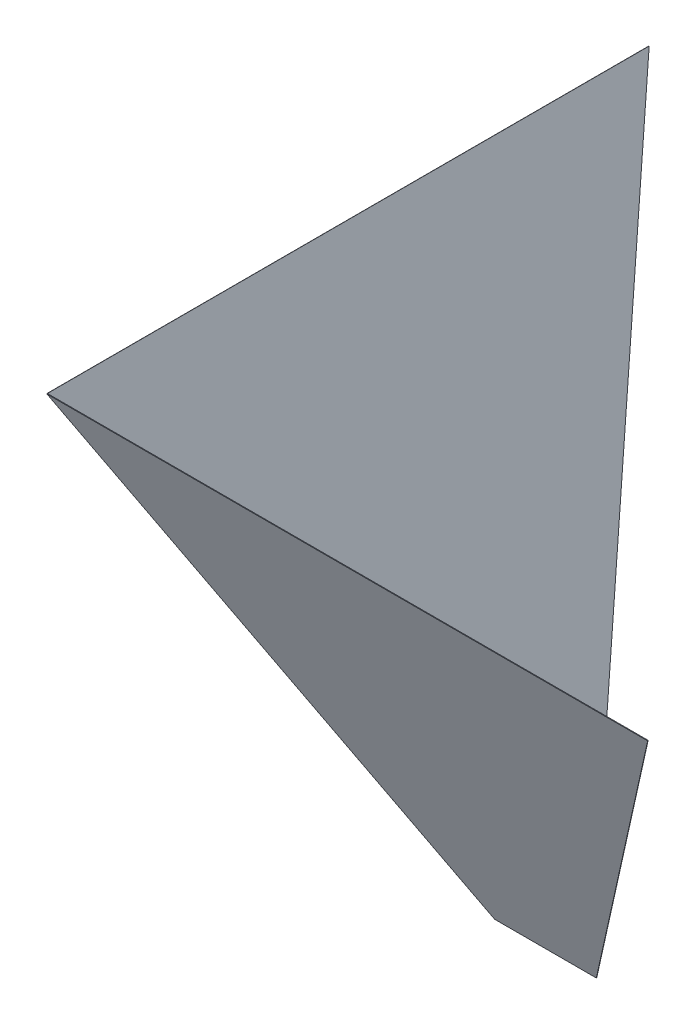
ISO-10303-21;
HEADER;
FILE_DESCRIPTION(('STEP AP214'),'2;1');
FILE_NAME('part.step','',(''),(''),'','','');
FILE_SCHEMA(('AUTOMOTIVE_DESIGN { 1 0 10303 214 1 1 1 1 }'));
ENDSEC;
DATA;
#1=APPLICATION_CONTEXT('core data for automotive mechanical design processes');
#2=APPLICATION_PROTOCOL_DEFINITION('international standard','automotive_design',2000,#1);
#3=PRODUCT_CONTEXT('',#1,'mechanical');
#4=PRODUCT('Part','Part','',(#3));
#5=PRODUCT_RELATED_PRODUCT_CATEGORY('part','',(#4));
#6=PRODUCT_DEFINITION_FORMATION('','',#4);
#7=PRODUCT_DEFINITION_CONTEXT('part definition',#1,'design');
#8=PRODUCT_DEFINITION('design','',#6,#7);
#9=PRODUCT_DEFINITION_SHAPE('','',#8);
#10=(LENGTH_UNIT() NAMED_UNIT(*) SI_UNIT(.MILLI.,.METRE.));
#11=(NAMED_UNIT(*) PLANE_ANGLE_UNIT() SI_UNIT($,.RADIAN.));
#12=(NAMED_UNIT(*) SI_UNIT($,.STERADIAN.) SOLID_ANGLE_UNIT());
#13=UNCERTAINTY_MEASURE_WITH_UNIT(LENGTH_MEASURE(1.E-05),#10,'distance_accuracy_value','');
#14=(GEOMETRIC_REPRESENTATION_CONTEXT(3) GLOBAL_UNCERTAINTY_ASSIGNED_CONTEXT((#13)) GLOBAL_UNIT_ASSIGNED_CONTEXT((#10,
#11,#12)) REPRESENTATION_CONTEXT('',''));
#15=CARTESIAN_POINT('',(0.,0.,0.));
#16=DIRECTION('',(0.,0.,1.));
#17=DIRECTION('',(1.,0.,0.));
#18=AXIS2_PLACEMENT_3D('',#15,#16,#17);
#19=CARTESIAN_POINT('',(243.,-418.,-193.));
#20=DIRECTION('',(0.,-0.907895803335264,-0.419195909195469));
#21=DIRECTION('',(1.,0.,0.));
#22=AXIS2_PLACEMENT_3D('',#19,#20,#21);
#23=PLANE('',#22);
#24=DIRECTION('',(0.,-0.419195909195469,0.907895803335264));
#25=VECTOR('',#24,1.);
#26=CARTESIAN_POINT('',(243.067251962338,-418.,-193.));
#27=LINE('',#26,#25);
#28=CARTESIAN_POINT('',(243.067251962338,-418.,-193.));
#29=VERTEX_POINT('',#28);
#30=CARTESIAN_POINT('',(243.067251962337,-418.209597954598,-192.546052098332));
#31=VERTEX_POINT('',#30);
#32=EDGE_CURVE('E11',#29,#31,#27,.T.);
#33=ORIENTED_EDGE('',*,*,#32,.F.);
#34=DIRECTION('',(1.,0.,0.));
#35=VECTOR('',#34,1.);
#36=CARTESIAN_POINT('',(243.,-418.,-193.));
#37=LINE('',#36,#35);
#38=CARTESIAN_POINT('',(342.,-418.,-193.));
#39=VERTEX_POINT('',#38);
#40=EDGE_CURVE('E157',#29,#39,#37,.T.);
#41=ORIENTED_EDGE('',*,*,#40,.T.);
#42=DIRECTION('',(0.,-0.419195909195469,0.907895803335264));
#43=VECTOR('',#42,1.);
#44=CARTESIAN_POINT('',(342.,-418.,-193.));
#45=LINE('',#44,#43);
#46=CARTESIAN_POINT('',(342.,-418.209597954598,-192.546052098332));
#47=VERTEX_POINT('',#46);
#48=EDGE_CURVE('E49',#39,#47,#45,.T.);
#49=ORIENTED_EDGE('',*,*,#48,.T.);
#50=DIRECTION('',(1.,0.,0.));
#51=VECTOR('',#50,1.);
#52=CARTESIAN_POINT('',(0.,-418.209597954598,-192.546052098332));
#53=LINE('',#52,#51);
#54=EDGE_CURVE('E154',#31,#47,#53,.T.);
#55=ORIENTED_EDGE('',*,*,#54,.F.);
#56=EDGE_LOOP('',(#33,#41,#49,#55));
#57=FACE_BOUND('',#56,.T.);
#58=ADVANCED_FACE('F37',(#57),#23,.T.);
#59=CARTESIAN_POINT('',(585.,0.,0.));
#60=DIRECTION('',(-0.884378142178995,0.423779563499546,0.195668554438786));
#61=DIRECTION('',(-0.466771144819418,-0.802923203845747,-0.370727699383323));
#62=AXIS2_PLACEMENT_3D('',#59,#60,#61);
#63=PLANE('',#62);
#64=ORIENTED_EDGE('',*,*,#48,.F.);
#65=DIRECTION('',(-0.466771144819418,-0.802923203845747,-0.370727699383323));
#66=VECTOR('',#65,1.);
#67=CARTESIAN_POINT('',(585.,0.,0.));
#68=LINE('',#67,#66);
#69=CARTESIAN_POINT('',(585.,0.,0.));
#70=VERTEX_POINT('',#69);
#71=EDGE_CURVE('E139',#70,#39,#68,.T.);
#72=ORIENTED_EDGE('',*,*,#71,.F.);
#73=DIRECTION('',(0.,-0.419195909195469,0.907895803335264));
#74=VECTOR('',#73,1.);
#75=CARTESIAN_POINT('',(585.,0.,0.));
#76=LINE('',#75,#74);
#77=CARTESIAN_POINT('',(585.,-0.209597954597734,0.453947901667632));
#78=VERTEX_POINT('',#77);
#79=EDGE_CURVE('E148',#70,#78,#76,.T.);
#80=ORIENTED_EDGE('',*,*,#79,.T.);
#81=DIRECTION('',(-0.466771144819418,-0.802923203845747,-0.370727699383323));
#82=VECTOR('',#81,1.);
#83=CARTESIAN_POINT('',(585.,-0.209597954597734,0.453947901667632));
#84=LINE('',#83,#82);
#85=EDGE_CURVE('E166',#78,#47,#84,.T.);
#86=ORIENTED_EDGE('',*,*,#85,.T.);
#87=EDGE_LOOP('',(#64,#72,#80,#86));
#88=FACE_BOUND('',#87,.T.);
#89=ADVANCED_FACE('F172',(#88),#63,.F.);
#90=CARTESIAN_POINT('',(585.,0.,0.));
#91=DIRECTION('',(0.,0.907895803335264,0.419195909195469));
#92=DIRECTION('',(-1.,0.,0.));
#93=AXIS2_PLACEMENT_3D('',#90,#91,#92);
#94=PLANE('',#93);
#95=ORIENTED_EDGE('',*,*,#79,.F.);
#96=DIRECTION('',(-1.,0.,0.));
#97=VECTOR('',#96,1.);
#98=CARTESIAN_POINT('',(585.,0.,0.));
#99=LINE('',#98,#97);
#100=CARTESIAN_POINT('',(0.0672519623375889,0.,0.));
#101=VERTEX_POINT('',#100);
#102=EDGE_CURVE('E137',#70,#101,#99,.T.);
#103=ORIENTED_EDGE('',*,*,#102,.T.);
#104=DIRECTION('',(-1.70832493407682E-13,-0.419195909195551,0.907895803335226));
#105=VECTOR('',#104,1.);
#106=CARTESIAN_POINT('',(0.0672519623375889,0.,0.));
#107=LINE('',#106,#105);
#108=CARTESIAN_POINT('',(0.0672519623375889,-0.209597954597734,0.453947901667632));
#109=VERTEX_POINT('',#108);
#110=EDGE_CURVE('E111',#101,#109,#107,.T.);
#111=ORIENTED_EDGE('',*,*,#110,.T.);
#112=DIRECTION('',(1.,0.,0.));
#113=VECTOR('',#112,1.);
#114=CARTESIAN_POINT('',(0.,-0.209597954597734,0.453947901667632));
#115=LINE('',#114,#113);
#116=EDGE_CURVE('E173',#78,#109,#115,.F.);
#117=ORIENTED_EDGE('',*,*,#116,.F.);
#118=EDGE_LOOP('',(#95,#103,#111,#117));
#119=FACE_BOUND('',#118,.T.);
#120=ADVANCED_FACE('F220',(#119),#94,.T.);
#121=CARTESIAN_POINT('',(0.471411140917739,0.298041242417086,-0.387874458643083));
#122=CARTESIAN_POINT('',(0.366621006275714,0.198694161611391,-0.30464608010024));
#123=CARTESIAN_POINT('',(0.26183087163369,0.0993470808056953,-0.221417701557397));
#124=CARTESIAN_POINT('',(0.157040736991665,0.,-0.138189323014554));
#125=CARTESIAN_POINT('',(1.18497564730447,0.298041242417086,0.510551318828298));
#126=CARTESIAN_POINT('',(0.872872090546348,0.198694161611391,0.332758134810455));
#127=CARTESIAN_POINT('',(0.560768533788223,0.0993470808056953,0.154964950792611));
#128=CARTESIAN_POINT('',(0.248664977030097,0.,-0.0228282332252333));
#129=CARTESIAN_POINT('',(0.412558471355378,-0.298041242417086,1.12403491947923));
#130=CARTESIAN_POINT('',(0.310035183881302,-0.198694161611391,0.779784978375697));
#131=CARTESIAN_POINT('',(0.207511896407226,-0.0993470808056954,0.435535037272167));
#132=CARTESIAN_POINT('',(0.10498860893315,0.,0.0912850961686378));
#133=CARTESIAN_POINT('',(-0.301006035031356,-0.298041242417086,0.225609142007845));
#134=CARTESIAN_POINT('',(-0.196215900389331,-0.198694161611391,0.142380763465002));
#135=CARTESIAN_POINT('',(-0.0914257657473065,-0.0993470808056953,0.0591523849221594));
#136=CARTESIAN_POINT('',(0.0133643688947183,0.,-0.0240759936206833));
#137=CARTESIAN_POINT('',(-1.01457054141809,-0.298041242417086,-0.672816635463536));
#138=CARTESIAN_POINT('',(-0.702466984659965,-0.198694161611391,-0.495023451445692));
#139=CARTESIAN_POINT('',(-0.390363427901839,-0.0993470808056953,-0.317230267427848));
#140=CARTESIAN_POINT('',(-0.0782598711437136,0.,-0.139437083410004));
#141=CARTESIAN_POINT('',(-0.242153365468995,0.298041242417086,-1.28630023611446));
#142=CARTESIAN_POINT('',(-0.139630077994919,0.198694161611391,-0.942050295010935));
#143=CARTESIAN_POINT('',(-0.0371067905208432,0.0993470808056954,-0.597800353907405));
#144=CARTESIAN_POINT('',(0.0654164969532328,0.,-0.253550412803875));
#145=CARTESIAN_POINT('',(0.471411140917739,0.298041242417086,-0.387874458643083));
#146=CARTESIAN_POINT('',(0.366621006275714,0.198694161611391,-0.30464608010024));
#147=CARTESIAN_POINT('',(0.26183087163369,0.0993470808056953,-0.221417701557397));
#148=CARTESIAN_POINT('',(0.157040736991665,0.,-0.138189323014554));
#149=(BOUNDED_SURFACE() B_SPLINE_SURFACE(3,3,((#121,#122,#123,#124),(#125,#126,#127,#128),(#129,
#130,#131,#132),(#133,#134,#135,#136),(#137,#138,#139,#140),(#141,#142,#143,#144),(#145,#146,
#147,#148)),.UNSPECIFIED.,.T.,.F.,.F.) B_SPLINE_SURFACE_WITH_KNOTS((4,3,4),(4,4),(0.,0.5,1.),
(0.,1.),.UNSPECIFIED.) GEOMETRIC_REPRESENTATION_ITEM() RATIONAL_B_SPLINE_SURFACE(((1.,1.,1.,1.),
(0.333333333333333,0.333333333333333,0.333333333333333,0.333333333333333),(0.333333333333333,
0.333333333333333,0.333333333333333,0.333333333333333),(1.,1.,1.,1.),(0.333333333333333,
0.333333333333333,0.333333333333333,0.333333333333333),(0.333333333333333,0.333333333333333,
0.333333333333333,0.333333333333333),(1.,1.,1.,1.))) REPRESENTATION_ITEM('') SURFACE());
#150=CARTESIAN_POINT('',(0.0852025529431916,0.,-0.0811326583176188));
#151=DIRECTION('',(0.,1.,0.));
#152=DIRECTION('',(0.78306468768206,0.,-0.621940266348303));
#153=AXIS2_PLACEMENT_3D('',#150,#151,#152);
#154=ELLIPSE('',#153,0.0917397823941219,0.07366);
#155=CARTESIAN_POINT('',(0.,0.,-0.0640395186886508));
#156=VERTEX_POINT('',#155);
#157=EDGE_CURVE('E120',#101,#156,#154,.F.);
#158=DIRECTION('',(-0.864528085785323,-0.502584509200558,0.));
#159=VECTOR('',#158,1.);
#160=CARTESIAN_POINT('',(0.,0.,-0.0640395186886508));
#161=LINE('',#160,#159);
#162=CARTESIAN_POINT('',(-0.432264042892661,-0.251292254600279,-0.0640395186886507));
#163=VERTEX_POINT('',#162);
#164=EDGE_CURVE('E57',#156,#163,#161,.T.);
#165=CARTESIAN_POINT('',(0.0852025529431916,0.,-0.0811326583176188));
#166=DIRECTION('',(-0.405000106794701,0.855865301600658,0.321666751487149));
#167=DIRECTION('',(0.670197895095831,0.517198787233704,-0.532297093635784));
#168=AXIS2_PLACEMENT_3D('',#165,#166,#167);
#169=ELLIPSE('',#168,0.576260520662071,0.57366);
#170=EDGE_CURVE('E175',#109,#163,#169,.F.);
#171=ORIENTED_EDGE('',*,*,#110,.F.);
#172=ORIENTED_EDGE('',*,*,#157,.T.);
#173=ORIENTED_EDGE('',*,*,#164,.T.);
#174=ORIENTED_EDGE('',*,*,#170,.F.);
#175=EDGE_LOOP('',(#171,#172,#173,#174));
#176=FACE_BOUND('',#175,.T.);
#177=ADVANCED_FACE('F135',(#176),#149,.F.);
#178=CARTESIAN_POINT('',(0.,0.,0.));
#179=DIRECTION('',(-0.502584509200558,0.864528085785323,0.));
#180=DIRECTION('',(0.,0.,-1.));
#181=AXIS2_PLACEMENT_3D('',#178,#179,#180);
#182=PLANE('',#181);
#183=ORIENTED_EDGE('',*,*,#164,.F.);
#184=DIRECTION('',(0.,0.,-1.));
#185=VECTOR('',#184,1.);
#186=CARTESIAN_POINT('',(0.,0.,0.));
#187=LINE('',#186,#185);
#188=CARTESIAN_POINT('',(0.,0.,-586.));
#189=VERTEX_POINT('',#188);
#190=EDGE_CURVE('E107',#156,#189,#187,.T.);
#191=ORIENTED_EDGE('',*,*,#190,.T.);
#192=DIRECTION('',(-0.864528085785323,-0.502584509200558,0.));
#193=VECTOR('',#192,1.);
#194=CARTESIAN_POINT('',(0.,0.,-586.));
#195=LINE('',#194,#193);
#196=CARTESIAN_POINT('',(-0.432264042892661,-0.251292254600279,-586.));
#197=VERTEX_POINT('',#196);
#198=EDGE_CURVE('E112',#189,#197,#195,.T.);
#199=ORIENTED_EDGE('',*,*,#198,.T.);
#200=DIRECTION('',(0.,0.,1.));
#201=VECTOR('',#200,1.);
#202=CARTESIAN_POINT('',(-0.432264042892661,-0.251292254600279,0.));
#203=LINE('',#202,#201);
#204=EDGE_CURVE('E109',#163,#197,#203,.F.);
#205=ORIENTED_EDGE('',*,*,#204,.F.);
#206=EDGE_LOOP('',(#183,#191,#199,#205));
#207=FACE_BOUND('',#206,.T.);
#208=ADVANCED_FACE('F104',(#207),#182,.T.);
#209=CARTESIAN_POINT('',(243.,-418.,-293.));
#210=DIRECTION('',(-0.26047040571741,0.448051973620896,0.85522195755244));
#211=DIRECTION('',(-0.429821307794034,0.739363401884388,-0.518261906105564));
#212=AXIS2_PLACEMENT_3D('',#209,#210,#211);
#213=PLANE('',#212);
#214=ORIENTED_EDGE('',*,*,#198,.F.);
#215=DIRECTION('',(-0.429821307794034,0.739363401884388,-0.518261906105564));
#216=VECTOR('',#215,1.);
#217=CARTESIAN_POINT('',(243.,-418.,-293.));
#218=LINE('',#217,#216);
#219=CARTESIAN_POINT('',(243.,-418.,-293.));
#220=VERTEX_POINT('',#219);
#221=EDGE_CURVE('E132',#220,#189,#218,.T.);
#222=ORIENTED_EDGE('',*,*,#221,.F.);
#223=DIRECTION('',(-0.864528085785323,-0.502584509200558,0.));
#224=VECTOR('',#223,1.);
#225=CARTESIAN_POINT('',(243.,-418.,-293.));
#226=LINE('',#225,#224);
#227=CARTESIAN_POINT('',(242.567735957107,-418.2512922546,-293.));
#228=VERTEX_POINT('',#227);
#229=EDGE_CURVE('E143',#220,#228,#226,.T.);
#230=ORIENTED_EDGE('',*,*,#229,.T.);
#231=DIRECTION('',(-0.429821307794034,0.739363401884388,-0.518261906105564));
#232=VECTOR('',#231,1.);
#233=CARTESIAN_POINT('',(242.567735957107,-418.2512922546,-293.));
#234=LINE('',#233,#232);
#235=EDGE_CURVE('E170',#228,#197,#234,.T.);
#236=ORIENTED_EDGE('',*,*,#235,.T.);
#237=EDGE_LOOP('',(#214,#222,#230,#236));
#238=FACE_BOUND('',#237,.T.);
#239=ADVANCED_FACE('F205',(#238),#213,.F.);
#240=CARTESIAN_POINT('',(243.,-418.,-293.));
#241=DIRECTION('',(0.502584509200558,-0.864528085785323,0.));
#242=DIRECTION('',(0.,0.,1.));
#243=AXIS2_PLACEMENT_3D('',#240,#241,#242);
#244=PLANE('',#243);
#245=ORIENTED_EDGE('',*,*,#229,.F.);
#246=DIRECTION('',(0.,0.,1.));
#247=VECTOR('',#246,1.);
#248=CARTESIAN_POINT('',(243.,-418.,-293.));
#249=LINE('',#248,#247);
#250=CARTESIAN_POINT('',(243.,-418.,-193.064039518689));
#251=VERTEX_POINT('',#250);
#252=EDGE_CURVE('E133',#220,#251,#249,.T.);
#253=ORIENTED_EDGE('',*,*,#252,.T.);
#254=DIRECTION('',(-0.86452808578445,-0.502584509202059,-3.768066198155E-13));
#255=VECTOR('',#254,1.);
#256=CARTESIAN_POINT('',(243.,-418.,-193.064039518689));
#257=LINE('',#256,#255);
#258=CARTESIAN_POINT('',(242.567735957107,-418.2512922546,-193.064039518689));
#259=VERTEX_POINT('',#258);
#260=EDGE_CURVE('E43',#251,#259,#257,.T.);
#261=ORIENTED_EDGE('',*,*,#260,.T.);
#262=DIRECTION('',(0.,0.,1.));
#263=VECTOR('',#262,1.);
#264=CARTESIAN_POINT('',(242.567735957107,-418.2512922546,0.));
#265=LINE('',#264,#263);
#266=EDGE_CURVE('E195',#228,#259,#265,.T.);
#267=ORIENTED_EDGE('',*,*,#266,.F.);
#268=EDGE_LOOP('',(#245,#253,#261,#267));
#269=FACE_BOUND('',#268,.T.);
#270=ADVANCED_FACE('F207',(#269),#244,.T.);
#271=CARTESIAN_POINT('',(243.471411140918,-417.701958757583,-193.387874458643));
#272=CARTESIAN_POINT('',(243.366621006276,-417.801305838389,-193.3046460801));
#273=CARTESIAN_POINT('',(243.261830871634,-417.900652919194,-193.221417701557));
#274=CARTESIAN_POINT('',(243.157040736992,-418.,-193.138189323015));
#275=CARTESIAN_POINT('',(242.757846634531,-417.701958757583,-194.286300236114));
#276=CARTESIAN_POINT('',(242.860369922005,-417.801305838389,-193.942050295011));
#277=CARTESIAN_POINT('',(242.962893209479,-417.900652919194,-193.597800353907));
#278=CARTESIAN_POINT('',(243.065416496953,-418.,-193.253550412804));
#279=CARTESIAN_POINT('',(241.985429458582,-418.298041242417,-193.672816635463));
#280=CARTESIAN_POINT('',(242.29753301534,-418.198694161611,-193.495023451446));
#281=CARTESIAN_POINT('',(242.609636572098,-418.099347080806,-193.317230267428));
#282=CARTESIAN_POINT('',(242.921740128856,-418.,-193.13943708341));
#283=CARTESIAN_POINT('',(242.698993964969,-418.298041242417,-192.774390857992));
#284=CARTESIAN_POINT('',(242.803784099611,-418.198694161611,-192.857619236535));
#285=CARTESIAN_POINT('',(242.908574234253,-418.099347080806,-192.940847615078));
#286=CARTESIAN_POINT('',(243.013364368895,-418.,-193.024075993621));
#287=CARTESIAN_POINT('',(243.412558471356,-418.298041242417,-191.875965080521));
#288=CARTESIAN_POINT('',(243.310035183881,-418.198694161611,-192.220215021624));
#289=CARTESIAN_POINT('',(243.207511896407,-418.099347080806,-192.564464962728));
#290=CARTESIAN_POINT('',(243.104988608933,-418.,-192.908714903831));
#291=CARTESIAN_POINT('',(244.184975647305,-417.701958757583,-192.489448681172));
#292=CARTESIAN_POINT('',(243.872872090546,-417.801305838389,-192.66724186519));
#293=CARTESIAN_POINT('',(243.560768533788,-417.900652919194,-192.845035049207));
#294=CARTESIAN_POINT('',(243.24866497703,-418.,-193.022828233225));
#295=CARTESIAN_POINT('',(243.471411140918,-417.701958757583,-193.387874458643));
#296=CARTESIAN_POINT('',(243.366621006276,-417.801305838389,-193.3046460801));
#297=CARTESIAN_POINT('',(243.261830871634,-417.900652919194,-193.221417701557));
#298=CARTESIAN_POINT('',(243.157040736992,-418.,-193.138189323015));
#299=(BOUNDED_SURFACE() B_SPLINE_SURFACE(3,3,((#271,#272,#273,#274),(#275,#276,#277,#278),(#279,
#280,#281,#282),(#283,#284,#285,#286),(#287,#288,#289,#290),(#291,#292,#293,#294),(#295,#296,
#297,#298)),.UNSPECIFIED.,.T.,.F.,.F.) B_SPLINE_SURFACE_WITH_KNOTS((4,3,4),(4,4),(0.,0.5,1.),
(0.,1.),.UNSPECIFIED.) GEOMETRIC_REPRESENTATION_ITEM() RATIONAL_B_SPLINE_SURFACE(((1.,1.,1.,1.),
(0.333333333333333,0.333333333333333,0.333333333333333,0.333333333333333),(0.333333333333333,
0.333333333333333,0.333333333333333,0.333333333333333),(1.,1.,1.,1.),(0.333333333333333,
0.333333333333333,0.333333333333333,0.333333333333333),(0.333333333333333,0.333333333333333,
0.333333333333333,0.333333333333333),(1.,1.,1.,1.))) REPRESENTATION_ITEM('') SURFACE());
#300=CARTESIAN_POINT('',(243.085202552943,-418.,-193.081132658318));
#301=DIRECTION('',(0.,-1.,0.));
#302=DIRECTION('',(0.78306468768206,0.,-0.621940266348303));
#303=AXIS2_PLACEMENT_3D('',#300,#301,#302);
#304=ELLIPSE('',#303,0.0917397823941219,0.07366);
#305=EDGE_CURVE('E122',#251,#29,#304,.F.);
#306=CARTESIAN_POINT('',(243.085202552943,-418.,-193.081132658318));
#307=DIRECTION('',(0.405000106794588,-0.855865301600745,-0.32166675148706));
#308=DIRECTION('',(0.670197895095777,0.51719878723356,-0.532297093635992));
#309=AXIS2_PLACEMENT_3D('',#306,#307,#308);
#310=ELLIPSE('',#309,0.576260520662069,0.57366);
#311=EDGE_CURVE('E126',#259,#31,#310,.F.);
#312=ORIENTED_EDGE('',*,*,#305,.T.);
#313=ORIENTED_EDGE('',*,*,#32,.T.);
#314=ORIENTED_EDGE('',*,*,#311,.F.);
#315=ORIENTED_EDGE('',*,*,#260,.F.);
#316=EDGE_LOOP('',(#312,#313,#314,#315));
#317=FACE_BOUND('',#316,.T.);
#318=ADVANCED_FACE('F39',(#317),#299,.F.);
#319=CARTESIAN_POINT('',(-0.432264042892661,-0.251292254600279,0.));
#320=DIRECTION('',(-0.864528085785323,-0.502584509200558,0.));
#321=DIRECTION('',(0.502584509200558,-0.864528085785323,0.));
#322=AXIS2_PLACEMENT_3D('',#319,#320,#321);
#323=PLANE('',#322);
#324=ORIENTED_EDGE('',*,*,#266,.T.);
#325=DIRECTION('',(0.466771144819417,-0.802923203845747,-0.370727699383323));
#326=VECTOR('',#325,1.);
#327=CARTESIAN_POINT('',(-0.443345760933944,-0.232229875418155,-0.0552379895448677));
#328=LINE('',#327,#326);
#329=EDGE_CURVE('E192',#259,#163,#328,.F.);
#330=ORIENTED_EDGE('',*,*,#329,.T.);
#331=ORIENTED_EDGE('',*,*,#204,.T.);
#332=ORIENTED_EDGE('',*,*,#235,.F.);
#333=EDGE_LOOP('',(#324,#330,#331,#332));
#334=FACE_BOUND('',#333,.T.);
#335=ADVANCED_FACE('F202',(#334),#323,.T.);
#336=CARTESIAN_POINT('',(0.,-0.209597954597734,0.453947901667632));
#337=DIRECTION('',(0.,-0.419195909195469,0.907895803335264));
#338=DIRECTION('',(0.,-0.907895803335264,-0.419195909195469));
#339=AXIS2_PLACEMENT_3D('',#336,#337,#338);
#340=PLANE('',#339);
#341=ORIENTED_EDGE('',*,*,#116,.T.);
#342=DIRECTION('',(0.466771144819417,-0.802923203845747,-0.370727699383323));
#343=VECTOR('',#342,1.);
#344=CARTESIAN_POINT('',(0.0525994207577806,-0.184393171139224,0.465585516996561));
#345=LINE('',#344,#343);
#346=EDGE_CURVE('E169',#109,#31,#345,.T.);
#347=ORIENTED_EDGE('',*,*,#346,.T.);
#348=ORIENTED_EDGE('',*,*,#54,.T.);
#349=ORIENTED_EDGE('',*,*,#85,.F.);
#350=EDGE_LOOP('',(#341,#347,#348,#349));
#351=FACE_BOUND('',#350,.T.);
#352=ADVANCED_FACE('F165',(#351),#340,.T.);
#353=CARTESIAN_POINT('',(0.0525994207576844,0.0560827541298025,-0.0552379895447674));
#354=DIRECTION('',(0.466771144819417,-0.802923203845747,-0.370727699383323));
#355=DIRECTION('',(0.864528085785323,0.502584509200558,0.));
#356=AXIS2_PLACEMENT_3D('',#353,#354,#355);
#357=CYLINDRICAL_SURFACE('',#356,0.57366);
#358=ORIENTED_EDGE('',*,*,#170,.T.);
#359=ORIENTED_EDGE('',*,*,#329,.F.);
#360=ORIENTED_EDGE('',*,*,#311,.T.);
#361=ORIENTED_EDGE('',*,*,#346,.F.);
#362=EDGE_LOOP('',(#358,#359,#360,#361));
#363=FACE_BOUND('',#362,.T.);
#364=ADVANCED_FACE('F191',(#363),#357,.T.);
#365=CARTESIAN_POINT('',(0.,0.,0.));
#366=DIRECTION('',(-0.864528085785323,-0.502584509200558,0.));
#367=DIRECTION('',(0.502584509200558,-0.864528085785323,0.));
#368=AXIS2_PLACEMENT_3D('',#365,#366,#367);
#369=PLANE('',#368);
#370=ORIENTED_EDGE('',*,*,#252,.F.);
#371=ORIENTED_EDGE('',*,*,#221,.T.);
#372=ORIENTED_EDGE('',*,*,#190,.F.);
#373=DIRECTION('',(0.466771144819417,-0.802923203845747,-0.370727699383323));
#374=VECTOR('',#373,1.);
#375=CARTESIAN_POINT('',(-0.0110817180412625,0.0190623791820893,-0.0552379895447674));
#376=LINE('',#375,#374);
#377=EDGE_CURVE('E117',#251,#156,#376,.F.);
#378=ORIENTED_EDGE('',*,*,#377,.F.);
#379=EDGE_LOOP('',(#370,#371,#372,#378));
#380=FACE_BOUND('',#379,.T.);
#381=ADVANCED_FACE('F130',(#380),#369,.F.);
#382=CARTESIAN_POINT('',(0.,0.,0.));
#383=DIRECTION('',(0.,-0.419195909195469,0.907895803335264));
#384=DIRECTION('',(0.,-0.907895803335264,-0.419195909195469));
#385=AXIS2_PLACEMENT_3D('',#382,#383,#384);
#386=PLANE('',#385);
#387=ORIENTED_EDGE('',*,*,#102,.F.);
#388=ORIENTED_EDGE('',*,*,#71,.T.);
#389=ORIENTED_EDGE('',*,*,#40,.F.);
#390=DIRECTION('',(0.466771144819417,-0.802923203845747,-0.370727699383323));
#391=VECTOR('',#390,1.);
#392=CARTESIAN_POINT('',(0.0525994207576925,0.0252047834584681,0.0116376153289099));
#393=LINE('',#392,#391);
#394=EDGE_CURVE('E127',#101,#29,#393,.T.);
#395=ORIENTED_EDGE('',*,*,#394,.F.);
#396=EDGE_LOOP('',(#387,#388,#389,#395));
#397=FACE_BOUND('',#396,.T.);
#398=ADVANCED_FACE('F187',(#397),#386,.F.);
#399=CARTESIAN_POINT('',(0.0525994207576844,0.0560827541298025,-0.0552379895447674));
#400=DIRECTION('',(0.466771144819417,-0.802923203845747,-0.370727699383323));
#401=DIRECTION('',(0.864528085785323,0.502584509200558,0.));
#402=AXIS2_PLACEMENT_3D('',#399,#400,#401);
#403=CYLINDRICAL_SURFACE('',#402,0.07366);
#404=ORIENTED_EDGE('',*,*,#157,.F.);
#405=ORIENTED_EDGE('',*,*,#394,.T.);
#406=ORIENTED_EDGE('',*,*,#305,.F.);
#407=ORIENTED_EDGE('',*,*,#377,.T.);
#408=EDGE_LOOP('',(#404,#405,#406,#407));
#409=FACE_BOUND('',#408,.T.);
#410=ADVANCED_FACE('F118',(#409),#403,.F.);
#411=CLOSED_SHELL('',(#58,#89,#120,#177,#208,#239,#270,#318,#335,#352,#364,#381,#398,#410));
#412=MANIFOLD_SOLID_BREP('B2',#411);
#413=ADVANCED_BREP_SHAPE_REPRESENTATION('',(#18,#412),#14);
#414=SHAPE_DEFINITION_REPRESENTATION(#9,#413);
ENDSEC;
END-ISO-10303-21;
